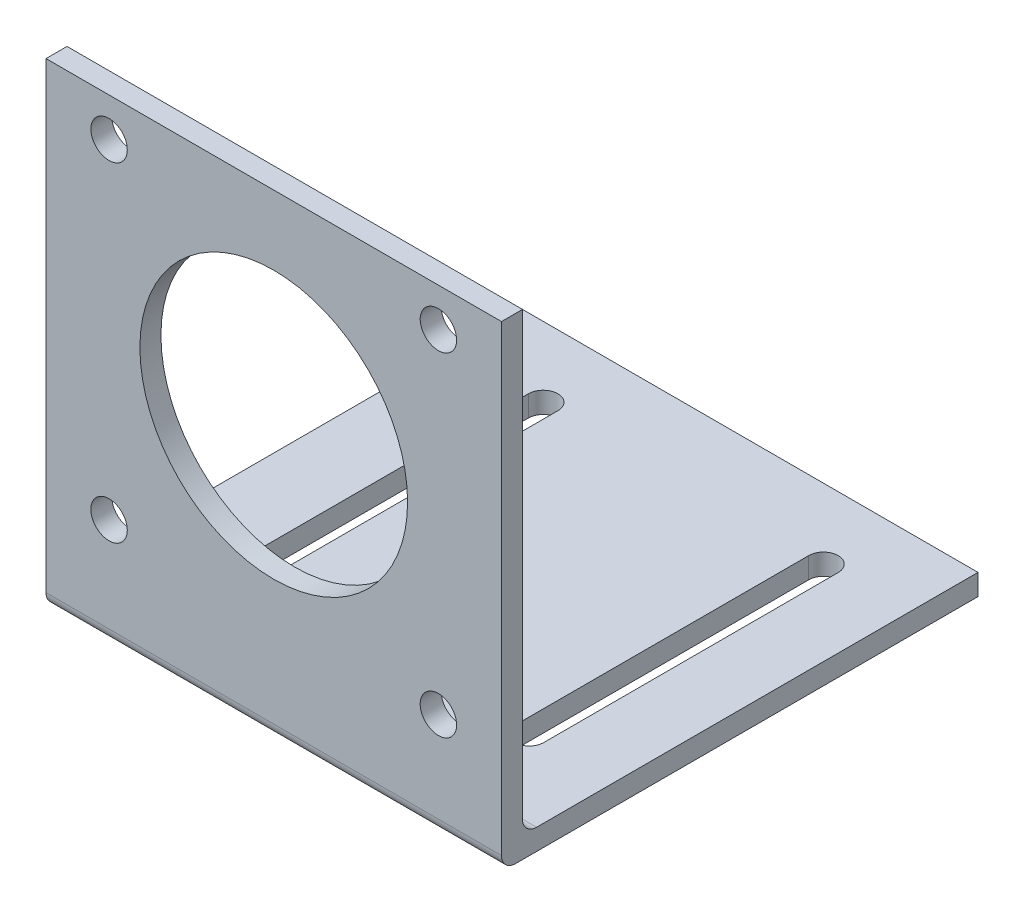
ISO-10303-21;
HEADER;
FILE_DESCRIPTION(('STEP AP214'),'2;1');
FILE_NAME('part.step','',(''),(''),'','','');
FILE_SCHEMA(('AUTOMOTIVE_DESIGN { 1 0 10303 214 1 1 1 1 }'));
ENDSEC;
DATA;
#1=APPLICATION_CONTEXT('core data for automotive mechanical design processes');
#2=APPLICATION_PROTOCOL_DEFINITION('international standard','automotive_design',2000,#1);
#3=PRODUCT_CONTEXT('',#1,'mechanical');
#4=PRODUCT('Part','Part','',(#3));
#5=PRODUCT_RELATED_PRODUCT_CATEGORY('part','',(#4));
#6=PRODUCT_DEFINITION_FORMATION('','',#4);
#7=PRODUCT_DEFINITION_CONTEXT('part definition',#1,'design');
#8=PRODUCT_DEFINITION('design','',#6,#7);
#9=PRODUCT_DEFINITION_SHAPE('','',#8);
#10=(LENGTH_UNIT() NAMED_UNIT(*) SI_UNIT(.MILLI.,.METRE.));
#11=(NAMED_UNIT(*) PLANE_ANGLE_UNIT() SI_UNIT($,.RADIAN.));
#12=(NAMED_UNIT(*) SI_UNIT($,.STERADIAN.) SOLID_ANGLE_UNIT());
#13=UNCERTAINTY_MEASURE_WITH_UNIT(LENGTH_MEASURE(1.E-05),#10,'distance_accuracy_value','');
#14=(GEOMETRIC_REPRESENTATION_CONTEXT(3) GLOBAL_UNCERTAINTY_ASSIGNED_CONTEXT((#13)) GLOBAL_UNIT_ASSIGNED_CONTEXT((#10,
#11,#12)) REPRESENTATION_CONTEXT('',''));
#15=CARTESIAN_POINT('',(0.,0.,0.));
#16=DIRECTION('',(0.,0.,1.));
#17=DIRECTION('',(1.,0.,0.));
#18=AXIS2_PLACEMENT_3D('',#15,#16,#17);
#19=CARTESIAN_POINT('',(65.,68.,0.));
#20=DIRECTION('',(0.,-1.,0.));
#21=DIRECTION('',(0.,0.,-1.));
#22=AXIS2_PLACEMENT_3D('',#19,#20,#21);
#23=PLANE('',#22);
#24=DIRECTION('',(0.,0.,1.));
#25=VECTOR('',#24,1.);
#26=CARTESIAN_POINT('',(0.,68.,0.));
#27=LINE('',#26,#25);
#28=CARTESIAN_POINT('',(0.,68.,-3.));
#29=VERTEX_POINT('',#28);
#30=CARTESIAN_POINT('',(0.,68.,0.));
#31=VERTEX_POINT('',#30);
#32=EDGE_CURVE('E190',#29,#31,#27,.T.);
#33=ORIENTED_EDGE('',*,*,#32,.T.);
#34=DIRECTION('',(-1.,0.,0.));
#35=VECTOR('',#34,1.);
#36=CARTESIAN_POINT('',(65.,68.,0.));
#37=LINE('',#36,#35);
#38=CARTESIAN_POINT('',(65.,68.,0.));
#39=VERTEX_POINT('',#38);
#40=EDGE_CURVE('E11',#39,#31,#37,.T.);
#41=ORIENTED_EDGE('',*,*,#40,.F.);
#42=DIRECTION('',(0.,0.,1.));
#43=VECTOR('',#42,1.);
#44=CARTESIAN_POINT('',(65.,68.,0.));
#45=LINE('',#44,#43);
#46=CARTESIAN_POINT('',(65.,68.,-3.));
#47=VERTEX_POINT('',#46);
#48=EDGE_CURVE('E223',#47,#39,#45,.T.);
#49=ORIENTED_EDGE('',*,*,#48,.F.);
#50=DIRECTION('',(-1.,0.,0.));
#51=VECTOR('',#50,1.);
#52=CARTESIAN_POINT('',(65.,68.,-3.));
#53=LINE('',#52,#51);
#54=EDGE_CURVE('E241',#47,#29,#53,.T.);
#55=ORIENTED_EDGE('',*,*,#54,.T.);
#56=EDGE_LOOP('',(#33,#41,#49,#55));
#57=FACE_BOUND('',#56,.T.);
#58=ADVANCED_FACE('F35',(#57),#23,.F.);
#59=CARTESIAN_POINT('',(65.,68.,0.));
#60=DIRECTION('',(0.,0.,-1.));
#61=DIRECTION('',(0.,1.,0.));
#62=AXIS2_PLACEMENT_3D('',#59,#60,#61);
#63=PLANE('',#62);
#64=CARTESIAN_POINT('',(9.,15.5,0.));
#65=DIRECTION('',(0.,0.,1.));
#66=DIRECTION('',(1.,0.,0.));
#67=AXIS2_PLACEMENT_3D('',#64,#65,#66);
#68=CIRCLE('',#67,2.6);
#69=CARTESIAN_POINT('',(11.6,15.5,0.));
#70=VERTEX_POINT('',#69);
#71=EDGE_CURVE('E420',#70,#70,#68,.T.);
#72=ORIENTED_EDGE('',*,*,#71,.F.);
#73=EDGE_LOOP('',(#72));
#74=FACE_BOUND('',#73,.T.);
#75=CARTESIAN_POINT('',(55.9966008458728,14.9347487870771,0.));
#76=DIRECTION('',(0.,0.,1.));
#77=DIRECTION('',(1.,0.,0.));
#78=AXIS2_PLACEMENT_3D('',#75,#76,#77);
#79=CIRCLE('',#78,2.6);
#80=CARTESIAN_POINT('',(58.5966008458728,14.9347487870771,0.));
#81=VERTEX_POINT('',#80);
#82=EDGE_CURVE('E416',#81,#81,#79,.T.);
#83=ORIENTED_EDGE('',*,*,#82,.F.);
#84=EDGE_LOOP('',(#83));
#85=FACE_BOUND('',#84,.T.);
#86=CARTESIAN_POINT('',(56.,62.5,0.));
#87=DIRECTION('',(0.,0.,1.));
#88=DIRECTION('',(1.,0.,0.));
#89=AXIS2_PLACEMENT_3D('',#86,#87,#88);
#90=CIRCLE('',#89,2.6);
#91=CARTESIAN_POINT('',(58.6,62.5,0.));
#92=VERTEX_POINT('',#91);
#93=EDGE_CURVE('E412',#92,#92,#90,.T.);
#94=ORIENTED_EDGE('',*,*,#93,.F.);
#95=EDGE_LOOP('',(#94));
#96=FACE_BOUND('',#95,.T.);
#97=CARTESIAN_POINT('',(9.,62.5,0.));
#98=DIRECTION('',(0.,0.,1.));
#99=DIRECTION('',(1.,0.,0.));
#100=AXIS2_PLACEMENT_3D('',#97,#98,#99);
#101=CIRCLE('',#100,2.6);
#102=CARTESIAN_POINT('',(11.6,62.5,0.));
#103=VERTEX_POINT('',#102);
#104=EDGE_CURVE('E410',#103,#103,#101,.T.);
#105=ORIENTED_EDGE('',*,*,#104,.F.);
#106=EDGE_LOOP('',(#105));
#107=FACE_BOUND('',#106,.T.);
#108=CARTESIAN_POINT('',(32.5,39.,0.));
#109=DIRECTION('',(0.,0.,1.));
#110=DIRECTION('',(1.,0.,0.));
#111=AXIS2_PLACEMENT_3D('',#108,#109,#110);
#112=CIRCLE('',#111,19.1);
#113=CARTESIAN_POINT('',(51.6,39.,0.));
#114=VERTEX_POINT('',#113);
#115=EDGE_CURVE('E177',#114,#114,#112,.T.);
#116=ORIENTED_EDGE('',*,*,#115,.F.);
#117=EDGE_LOOP('',(#116));
#118=FACE_BOUND('',#117,.T.);
#119=DIRECTION('',(0.,-1.,0.));
#120=VECTOR('',#119,1.);
#121=CARTESIAN_POINT('',(0.,68.,0.));
#122=LINE('',#121,#120);
#123=CARTESIAN_POINT('',(0.,2.00000000000001,0.));
#124=VERTEX_POINT('',#123);
#125=EDGE_CURVE('E244',#31,#124,#122,.T.);
#126=ORIENTED_EDGE('',*,*,#125,.T.);
#127=DIRECTION('',(-1.,0.,0.));
#128=VECTOR('',#127,1.);
#129=CARTESIAN_POINT('',(65.,2.00000000000001,0.));
#130=LINE('',#129,#128);
#131=CARTESIAN_POINT('',(65.,2.00000000000001,0.));
#132=VERTEX_POINT('',#131);
#133=EDGE_CURVE('E43',#132,#124,#130,.T.);
#134=ORIENTED_EDGE('',*,*,#133,.F.);
#135=DIRECTION('',(0.,-1.,0.));
#136=VECTOR('',#135,1.);
#137=CARTESIAN_POINT('',(65.,68.,0.));
#138=LINE('',#137,#136);
#139=EDGE_CURVE('E226',#39,#132,#138,.T.);
#140=ORIENTED_EDGE('',*,*,#139,.F.);
#141=ORIENTED_EDGE('',*,*,#40,.T.);
#142=EDGE_LOOP('',(#126,#134,#140,#141));
#143=FACE_BOUND('',#142,.T.);
#144=ADVANCED_FACE('F307',(#74,#85,#96,#107,#118,#143),#63,.F.);
#145=CARTESIAN_POINT('',(65.,2.,-2.));
#146=DIRECTION('',(-1.,0.,0.));
#147=DIRECTION('',(0.,0.,1.));
#148=AXIS2_PLACEMENT_3D('',#145,#146,#147);
#149=CYLINDRICAL_SURFACE('',#148,2.);
#150=CARTESIAN_POINT('',(0.,2.,-2.));
#151=DIRECTION('',(1.,0.,0.));
#152=DIRECTION('',(0.,0.,-1.));
#153=AXIS2_PLACEMENT_3D('',#150,#151,#152);
#154=CIRCLE('',#153,2.);
#155=CARTESIAN_POINT('',(0.,0.,-2.00000000000001));
#156=VERTEX_POINT('',#155);
#157=EDGE_CURVE('E246',#124,#156,#154,.T.);
#158=ORIENTED_EDGE('',*,*,#157,.T.);
#159=DIRECTION('',(-1.,0.,0.));
#160=VECTOR('',#159,1.);
#161=CARTESIAN_POINT('',(65.,0.,-2.00000000000001));
#162=LINE('',#161,#160);
#163=CARTESIAN_POINT('',(65.,0.,-2.00000000000001));
#164=VERTEX_POINT('',#163);
#165=EDGE_CURVE('E271',#164,#156,#162,.T.);
#166=ORIENTED_EDGE('',*,*,#165,.F.);
#167=CARTESIAN_POINT('',(65.,2.,-2.));
#168=DIRECTION('',(1.,0.,0.));
#169=DIRECTION('',(0.,0.,-1.));
#170=AXIS2_PLACEMENT_3D('',#167,#168,#169);
#171=CIRCLE('',#170,2.);
#172=EDGE_CURVE('E229',#132,#164,#171,.T.);
#173=ORIENTED_EDGE('',*,*,#172,.F.);
#174=ORIENTED_EDGE('',*,*,#133,.T.);
#175=EDGE_LOOP('',(#158,#166,#173,#174));
#176=FACE_BOUND('',#175,.T.);
#177=ADVANCED_FACE('F312',(#176),#149,.T.);
#178=CARTESIAN_POINT('',(65.,0.,-2.00000000000001));
#179=DIRECTION('',(0.,1.,0.));
#180=DIRECTION('',(0.,0.,1.));
#181=AXIS2_PLACEMENT_3D('',#178,#179,#180);
#182=PLANE('',#181);
#183=DIRECTION('',(0.,0.,-1.));
#184=VECTOR('',#183,1.);
#185=CARTESIAN_POINT('',(55.0454538110923,0.,-58.));
#186=LINE('',#185,#184);
#187=CARTESIAN_POINT('',(55.0454538110923,0.,-16.));
#188=VERTEX_POINT('',#187);
#189=CARTESIAN_POINT('',(55.0454538110923,0.,-58.));
#190=VERTEX_POINT('',#189);
#191=EDGE_CURVE('E161',#188,#190,#186,.T.);
#192=ORIENTED_EDGE('',*,*,#191,.T.);
#193=CARTESIAN_POINT('',(52.9454538110923,0.,-58.));
#194=DIRECTION('',(0.,1.,0.));
#195=DIRECTION('',(0.,0.,1.));
#196=AXIS2_PLACEMENT_3D('',#193,#194,#195);
#197=CIRCLE('',#196,2.1);
#198=CARTESIAN_POINT('',(50.8454538110923,0.,-58.));
#199=VERTEX_POINT('',#198);
#200=EDGE_CURVE('E153',#190,#199,#197,.T.);
#201=ORIENTED_EDGE('',*,*,#200,.T.);
#202=DIRECTION('',(0.,0.,1.));
#203=VECTOR('',#202,1.);
#204=CARTESIAN_POINT('',(50.8454538110923,0.,-58.));
#205=LINE('',#204,#203);
#206=CARTESIAN_POINT('',(50.8454538110923,0.,-16.));
#207=VERTEX_POINT('',#206);
#208=EDGE_CURVE('E164',#199,#207,#205,.T.);
#209=ORIENTED_EDGE('',*,*,#208,.T.);
#210=CARTESIAN_POINT('',(52.9454538110923,0.,-16.));
#211=DIRECTION('',(0.,1.,0.));
#212=DIRECTION('',(0.,0.,1.));
#213=AXIS2_PLACEMENT_3D('',#210,#211,#212);
#214=CIRCLE('',#213,2.10000000000001);
#215=EDGE_CURVE('E51',#207,#188,#214,.T.);
#216=ORIENTED_EDGE('',*,*,#215,.T.);
#217=EDGE_LOOP('',(#192,#201,#209,#216));
#218=FACE_BOUND('',#217,.T.);
#219=DIRECTION('',(0.,0.,-1.));
#220=VECTOR('',#219,1.);
#221=CARTESIAN_POINT('',(15.0454538110923,0.,-58.));
#222=LINE('',#221,#220);
#223=CARTESIAN_POINT('',(15.0454538110923,0.,-16.));
#224=VERTEX_POINT('',#223);
#225=CARTESIAN_POINT('',(15.0454538110923,0.,-58.));
#226=VERTEX_POINT('',#225);
#227=EDGE_CURVE('E202',#224,#226,#222,.T.);
#228=ORIENTED_EDGE('',*,*,#227,.T.);
#229=CARTESIAN_POINT('',(12.9454538110923,0.,-58.));
#230=DIRECTION('',(0.,1.,0.));
#231=DIRECTION('',(0.,0.,-1.));
#232=AXIS2_PLACEMENT_3D('',#229,#230,#231);
#233=CIRCLE('',#232,2.1);
#234=CARTESIAN_POINT('',(10.8454538110923,0.,-58.));
#235=VERTEX_POINT('',#234);
#236=EDGE_CURVE('E194',#226,#235,#233,.T.);
#237=ORIENTED_EDGE('',*,*,#236,.T.);
#238=DIRECTION('',(0.,0.,1.));
#239=VECTOR('',#238,1.);
#240=CARTESIAN_POINT('',(10.8454538110923,0.,-58.));
#241=LINE('',#240,#239);
#242=CARTESIAN_POINT('',(10.8454538110923,0.,-16.));
#243=VERTEX_POINT('',#242);
#244=EDGE_CURVE('E197',#235,#243,#241,.T.);
#245=ORIENTED_EDGE('',*,*,#244,.T.);
#246=CARTESIAN_POINT('',(12.9454538110923,0.,-16.));
#247=DIRECTION('',(0.,1.,0.));
#248=DIRECTION('',(0.,0.,-1.));
#249=AXIS2_PLACEMENT_3D('',#246,#247,#248);
#250=CIRCLE('',#249,2.10000000000001);
#251=EDGE_CURVE('E59',#243,#224,#250,.T.);
#252=ORIENTED_EDGE('',*,*,#251,.T.);
#253=EDGE_LOOP('',(#228,#237,#245,#252));
#254=FACE_BOUND('',#253,.T.);
#255=DIRECTION('',(0.,0.,-1.));
#256=VECTOR('',#255,1.);
#257=CARTESIAN_POINT('',(0.,0.,-2.00000000000001));
#258=LINE('',#257,#256);
#259=CARTESIAN_POINT('',(0.,0.,-68.));
#260=VERTEX_POINT('',#259);
#261=EDGE_CURVE('E248',#156,#260,#258,.T.);
#262=ORIENTED_EDGE('',*,*,#261,.T.);
#263=DIRECTION('',(-1.,0.,0.));
#264=VECTOR('',#263,1.);
#265=CARTESIAN_POINT('',(65.,0.,-68.));
#266=LINE('',#265,#264);
#267=CARTESIAN_POINT('',(65.,0.,-68.));
#268=VERTEX_POINT('',#267);
#269=EDGE_CURVE('E268',#268,#260,#266,.T.);
#270=ORIENTED_EDGE('',*,*,#269,.F.);
#271=DIRECTION('',(0.,0.,-1.));
#272=VECTOR('',#271,1.);
#273=CARTESIAN_POINT('',(65.,0.,-2.00000000000001));
#274=LINE('',#273,#272);
#275=EDGE_CURVE('E231',#164,#268,#274,.T.);
#276=ORIENTED_EDGE('',*,*,#275,.F.);
#277=ORIENTED_EDGE('',*,*,#165,.T.);
#278=EDGE_LOOP('',(#262,#270,#276,#277));
#279=FACE_BOUND('',#278,.T.);
#280=ADVANCED_FACE('F168',(#218,#254,#279),#182,.F.);
#281=CARTESIAN_POINT('',(65.,0.,-68.));
#282=DIRECTION('',(0.,0.,1.));
#283=DIRECTION('',(1.,0.,0.));
#284=AXIS2_PLACEMENT_3D('',#281,#282,#283);
#285=PLANE('',#284);
#286=DIRECTION('',(0.,1.,0.));
#287=VECTOR('',#286,1.);
#288=CARTESIAN_POINT('',(0.,0.,-68.));
#289=LINE('',#288,#287);
#290=CARTESIAN_POINT('',(0.,3.,-68.));
#291=VERTEX_POINT('',#290);
#292=EDGE_CURVE('E250',#260,#291,#289,.T.);
#293=ORIENTED_EDGE('',*,*,#292,.T.);
#294=DIRECTION('',(-1.,0.,0.));
#295=VECTOR('',#294,1.);
#296=CARTESIAN_POINT('',(65.,3.,-68.));
#297=LINE('',#296,#295);
#298=CARTESIAN_POINT('',(65.,3.,-68.));
#299=VERTEX_POINT('',#298);
#300=EDGE_CURVE('E265',#299,#291,#297,.T.);
#301=ORIENTED_EDGE('',*,*,#300,.F.);
#302=DIRECTION('',(0.,1.,0.));
#303=VECTOR('',#302,1.);
#304=CARTESIAN_POINT('',(65.,0.,-68.));
#305=LINE('',#304,#303);
#306=EDGE_CURVE('E233',#268,#299,#305,.T.);
#307=ORIENTED_EDGE('',*,*,#306,.F.);
#308=ORIENTED_EDGE('',*,*,#269,.T.);
#309=EDGE_LOOP('',(#293,#301,#307,#308));
#310=FACE_BOUND('',#309,.T.);
#311=ADVANCED_FACE('F344',(#310),#285,.F.);
#312=CARTESIAN_POINT('',(65.,3.,-68.));
#313=DIRECTION('',(0.,-1.,0.));
#314=DIRECTION('',(0.,0.,-1.));
#315=AXIS2_PLACEMENT_3D('',#312,#313,#314);
#316=PLANE('',#315);
#317=DIRECTION('',(0.,0.,1.));
#318=VECTOR('',#317,1.);
#319=CARTESIAN_POINT('',(50.8454538110923,3.,-58.));
#320=LINE('',#319,#318);
#321=CARTESIAN_POINT('',(50.8454538110923,3.,-58.));
#322=VERTEX_POINT('',#321);
#323=CARTESIAN_POINT('',(50.8454538110923,3.,-16.));
#324=VERTEX_POINT('',#323);
#325=EDGE_CURVE('E183',#322,#324,#320,.T.);
#326=ORIENTED_EDGE('',*,*,#325,.F.);
#327=CARTESIAN_POINT('',(52.9454538110923,3.,-58.));
#328=DIRECTION('',(0.,1.,0.));
#329=DIRECTION('',(0.,0.,1.));
#330=AXIS2_PLACEMENT_3D('',#327,#328,#329);
#331=CIRCLE('',#330,2.1);
#332=CARTESIAN_POINT('',(55.0454538110923,3.,-58.));
#333=VERTEX_POINT('',#332);
#334=EDGE_CURVE('E156',#333,#322,#331,.T.);
#335=ORIENTED_EDGE('',*,*,#334,.F.);
#336=DIRECTION('',(0.,0.,-1.));
#337=VECTOR('',#336,1.);
#338=CARTESIAN_POINT('',(55.0454538110923,3.,-58.));
#339=LINE('',#338,#337);
#340=CARTESIAN_POINT('',(55.0454538110923,3.,-16.));
#341=VERTEX_POINT('',#340);
#342=EDGE_CURVE('E171',#341,#333,#339,.T.);
#343=ORIENTED_EDGE('',*,*,#342,.F.);
#344=CARTESIAN_POINT('',(52.9454538110923,3.,-16.));
#345=DIRECTION('',(0.,1.,0.));
#346=DIRECTION('',(0.,0.,1.));
#347=AXIS2_PLACEMENT_3D('',#344,#345,#346);
#348=CIRCLE('',#347,2.10000000000001);
#349=EDGE_CURVE('E174',#324,#341,#348,.T.);
#350=ORIENTED_EDGE('',*,*,#349,.F.);
#351=EDGE_LOOP('',(#326,#335,#343,#350));
#352=FACE_BOUND('',#351,.T.);
#353=DIRECTION('',(0.,0.,1.));
#354=VECTOR('',#353,1.);
#355=CARTESIAN_POINT('',(10.8454538110923,3.,-58.));
#356=LINE('',#355,#354);
#357=CARTESIAN_POINT('',(10.8454538110923,3.,-58.));
#358=VERTEX_POINT('',#357);
#359=CARTESIAN_POINT('',(10.8454538110923,3.,-16.));
#360=VERTEX_POINT('',#359);
#361=EDGE_CURVE('E208',#358,#360,#356,.T.);
#362=ORIENTED_EDGE('',*,*,#361,.F.);
#363=CARTESIAN_POINT('',(12.9454538110923,3.,-58.));
#364=DIRECTION('',(0.,1.,0.));
#365=DIRECTION('',(0.,0.,-1.));
#366=AXIS2_PLACEMENT_3D('',#363,#364,#365);
#367=CIRCLE('',#366,2.1);
#368=CARTESIAN_POINT('',(15.0454538110923,3.,-58.));
#369=VERTEX_POINT('',#368);
#370=EDGE_CURVE('E206',#369,#358,#367,.T.);
#371=ORIENTED_EDGE('',*,*,#370,.F.);
#372=DIRECTION('',(0.,0.,-1.));
#373=VECTOR('',#372,1.);
#374=CARTESIAN_POINT('',(15.0454538110923,3.,-58.));
#375=LINE('',#374,#373);
#376=CARTESIAN_POINT('',(15.0454538110923,3.,-16.));
#377=VERTEX_POINT('',#376);
#378=EDGE_CURVE('E198',#377,#369,#375,.T.);
#379=ORIENTED_EDGE('',*,*,#378,.F.);
#380=CARTESIAN_POINT('',(12.9454538110923,3.,-16.));
#381=DIRECTION('',(0.,1.,0.));
#382=DIRECTION('',(0.,0.,-1.));
#383=AXIS2_PLACEMENT_3D('',#380,#381,#382);
#384=CIRCLE('',#383,2.10000000000001);
#385=EDGE_CURVE('E211',#360,#377,#384,.T.);
#386=ORIENTED_EDGE('',*,*,#385,.F.);
#387=EDGE_LOOP('',(#362,#371,#379,#386));
#388=FACE_BOUND('',#387,.T.);
#389=DIRECTION('',(0.,0.,1.));
#390=VECTOR('',#389,1.);
#391=CARTESIAN_POINT('',(0.,3.,-68.));
#392=LINE('',#391,#390);
#393=CARTESIAN_POINT('',(0.,2.99999999999999,-5.00000000000002));
#394=VERTEX_POINT('',#393);
#395=EDGE_CURVE('E252',#291,#394,#392,.T.);
#396=ORIENTED_EDGE('',*,*,#395,.T.);
#397=DIRECTION('',(-1.,0.,0.));
#398=VECTOR('',#397,1.);
#399=CARTESIAN_POINT('',(65.,2.99999999999999,-5.00000000000002));
#400=LINE('',#399,#398);
#401=CARTESIAN_POINT('',(65.,2.99999999999999,-5.00000000000002));
#402=VERTEX_POINT('',#401);
#403=EDGE_CURVE('E262',#402,#394,#400,.T.);
#404=ORIENTED_EDGE('',*,*,#403,.F.);
#405=DIRECTION('',(0.,0.,1.));
#406=VECTOR('',#405,1.);
#407=CARTESIAN_POINT('',(65.,3.,-68.));
#408=LINE('',#407,#406);
#409=EDGE_CURVE('E235',#299,#402,#408,.T.);
#410=ORIENTED_EDGE('',*,*,#409,.F.);
#411=ORIENTED_EDGE('',*,*,#300,.T.);
#412=EDGE_LOOP('',(#396,#404,#410,#411));
#413=FACE_BOUND('',#412,.T.);
#414=ADVANCED_FACE('F339',(#352,#388,#413),#316,.F.);
#415=CARTESIAN_POINT('',(65.,4.99999999999999,-5.));
#416=DIRECTION('',(-1.,0.,0.));
#417=DIRECTION('',(0.,0.,1.));
#418=AXIS2_PLACEMENT_3D('',#415,#416,#417);
#419=CYLINDRICAL_SURFACE('',#418,2.);
#420=CARTESIAN_POINT('',(0.,4.99999999999999,-5.));
#421=DIRECTION('',(-1.,0.,0.));
#422=DIRECTION('',(0.,0.,1.));
#423=AXIS2_PLACEMENT_3D('',#420,#421,#422);
#424=CIRCLE('',#423,2.);
#425=CARTESIAN_POINT('',(0.,4.99999999999999,-3.));
#426=VERTEX_POINT('',#425);
#427=EDGE_CURVE('E254',#394,#426,#424,.T.);
#428=ORIENTED_EDGE('',*,*,#427,.T.);
#429=DIRECTION('',(-1.,0.,0.));
#430=VECTOR('',#429,1.);
#431=CARTESIAN_POINT('',(65.,4.99999999999999,-3.));
#432=LINE('',#431,#430);
#433=CARTESIAN_POINT('',(65.,4.99999999999999,-3.));
#434=VERTEX_POINT('',#433);
#435=EDGE_CURVE('E259',#434,#426,#432,.T.);
#436=ORIENTED_EDGE('',*,*,#435,.F.);
#437=CARTESIAN_POINT('',(65.,4.99999999999999,-5.));
#438=DIRECTION('',(-1.,0.,0.));
#439=DIRECTION('',(0.,0.,1.));
#440=AXIS2_PLACEMENT_3D('',#437,#438,#439);
#441=CIRCLE('',#440,2.);
#442=EDGE_CURVE('E237',#402,#434,#441,.T.);
#443=ORIENTED_EDGE('',*,*,#442,.F.);
#444=ORIENTED_EDGE('',*,*,#403,.T.);
#445=EDGE_LOOP('',(#428,#436,#443,#444));
#446=FACE_BOUND('',#445,.T.);
#447=ADVANCED_FACE('F334',(#446),#419,.F.);
#448=CARTESIAN_POINT('',(65.,5.00000000000001,-3.));
#449=DIRECTION('',(0.,0.,1.));
#450=DIRECTION('',(0.,-1.,0.));
#451=AXIS2_PLACEMENT_3D('',#448,#449,#450);
#452=PLANE('',#451);
#453=CARTESIAN_POINT('',(9.,15.5,-3.));
#454=DIRECTION('',(0.,0.,1.));
#455=DIRECTION('',(0.,-1.,0.));
#456=AXIS2_PLACEMENT_3D('',#453,#454,#455);
#457=CIRCLE('',#456,2.6);
#458=CARTESIAN_POINT('',(9.,12.9,-3.));
#459=VERTEX_POINT('',#458);
#460=EDGE_CURVE('E38',#459,#459,#457,.T.);
#461=ORIENTED_EDGE('',*,*,#460,.T.);
#462=EDGE_LOOP('',(#461));
#463=FACE_BOUND('',#462,.T.);
#464=CARTESIAN_POINT('',(55.9966008458728,14.9347487870771,-3.));
#465=DIRECTION('',(0.,0.,1.));
#466=DIRECTION('',(0.,-1.,0.));
#467=AXIS2_PLACEMENT_3D('',#464,#465,#466);
#468=CIRCLE('',#467,2.6);
#469=CARTESIAN_POINT('',(55.9966008458728,12.3347487870771,-3.));
#470=VERTEX_POINT('',#469);
#471=EDGE_CURVE('E284',#470,#470,#468,.T.);
#472=ORIENTED_EDGE('',*,*,#471,.T.);
#473=EDGE_LOOP('',(#472));
#474=FACE_BOUND('',#473,.T.);
#475=CARTESIAN_POINT('',(56.,62.5,-3.));
#476=DIRECTION('',(0.,0.,1.));
#477=DIRECTION('',(0.,-1.,0.));
#478=AXIS2_PLACEMENT_3D('',#475,#476,#477);
#479=CIRCLE('',#478,2.6);
#480=CARTESIAN_POINT('',(56.,59.9,-3.));
#481=VERTEX_POINT('',#480);
#482=EDGE_CURVE('E282',#481,#481,#479,.T.);
#483=ORIENTED_EDGE('',*,*,#482,.T.);
#484=EDGE_LOOP('',(#483));
#485=FACE_BOUND('',#484,.T.);
#486=CARTESIAN_POINT('',(9.,62.5,-3.));
#487=DIRECTION('',(0.,0.,1.));
#488=DIRECTION('',(0.,-1.,0.));
#489=AXIS2_PLACEMENT_3D('',#486,#487,#488);
#490=CIRCLE('',#489,2.6);
#491=CARTESIAN_POINT('',(9.,59.9,-3.));
#492=VERTEX_POINT('',#491);
#493=EDGE_CURVE('E279',#492,#492,#490,.T.);
#494=ORIENTED_EDGE('',*,*,#493,.T.);
#495=EDGE_LOOP('',(#494));
#496=FACE_BOUND('',#495,.T.);
#497=CARTESIAN_POINT('',(32.5,39.,-3.));
#498=DIRECTION('',(0.,0.,1.));
#499=DIRECTION('',(0.,-1.,0.));
#500=AXIS2_PLACEMENT_3D('',#497,#498,#499);
#501=CIRCLE('',#500,19.1);
#502=CARTESIAN_POINT('',(32.5,19.9,-3.));
#503=VERTEX_POINT('',#502);
#504=EDGE_CURVE('E276',#503,#503,#501,.T.);
#505=ORIENTED_EDGE('',*,*,#504,.T.);
#506=EDGE_LOOP('',(#505));
#507=FACE_BOUND('',#506,.T.);
#508=DIRECTION('',(0.,1.,0.));
#509=VECTOR('',#508,1.);
#510=CARTESIAN_POINT('',(0.,5.00000000000001,-3.));
#511=LINE('',#510,#509);
#512=EDGE_CURVE('E227',#426,#29,#511,.T.);
#513=ORIENTED_EDGE('',*,*,#512,.T.);
#514=ORIENTED_EDGE('',*,*,#54,.F.);
#515=DIRECTION('',(0.,1.,0.));
#516=VECTOR('',#515,1.);
#517=CARTESIAN_POINT('',(65.,5.00000000000001,-3.));
#518=LINE('',#517,#516);
#519=EDGE_CURVE('E239',#434,#47,#518,.T.);
#520=ORIENTED_EDGE('',*,*,#519,.F.);
#521=ORIENTED_EDGE('',*,*,#435,.T.);
#522=EDGE_LOOP('',(#513,#514,#520,#521));
#523=FACE_BOUND('',#522,.T.);
#524=ADVANCED_FACE('F291',(#463,#474,#485,#496,#507,#523),#452,.F.);
#525=CARTESIAN_POINT('',(65.,4.99999999999999,-5.));
#526=DIRECTION('',(-1.,0.,0.));
#527=DIRECTION('',(0.,0.,1.));
#528=AXIS2_PLACEMENT_3D('',#525,#526,#527);
#529=PLANE('',#528);
#530=ORIENTED_EDGE('',*,*,#48,.T.);
#531=ORIENTED_EDGE('',*,*,#139,.T.);
#532=ORIENTED_EDGE('',*,*,#172,.T.);
#533=ORIENTED_EDGE('',*,*,#275,.T.);
#534=ORIENTED_EDGE('',*,*,#306,.T.);
#535=ORIENTED_EDGE('',*,*,#409,.T.);
#536=ORIENTED_EDGE('',*,*,#442,.T.);
#537=ORIENTED_EDGE('',*,*,#519,.T.);
#538=EDGE_LOOP('',(#530,#531,#532,#533,#534,#535,#536,#537));
#539=FACE_BOUND('',#538,.T.);
#540=ADVANCED_FACE('F328',(#539),#529,.F.);
#541=CARTESIAN_POINT('',(0.,4.99999999999999,-5.));
#542=DIRECTION('',(-1.,0.,0.));
#543=DIRECTION('',(0.,0.,1.));
#544=AXIS2_PLACEMENT_3D('',#541,#542,#543);
#545=PLANE('',#544);
#546=ORIENTED_EDGE('',*,*,#32,.F.);
#547=ORIENTED_EDGE('',*,*,#512,.F.);
#548=ORIENTED_EDGE('',*,*,#427,.F.);
#549=ORIENTED_EDGE('',*,*,#395,.F.);
#550=ORIENTED_EDGE('',*,*,#292,.F.);
#551=ORIENTED_EDGE('',*,*,#261,.F.);
#552=ORIENTED_EDGE('',*,*,#157,.F.);
#553=ORIENTED_EDGE('',*,*,#125,.F.);
#554=EDGE_LOOP('',(#546,#547,#548,#549,#550,#551,#552,#553));
#555=FACE_BOUND('',#554,.T.);
#556=ADVANCED_FACE('F320',(#555),#545,.T.);
#557=CARTESIAN_POINT('',(12.9454538110923,0.,-58.));
#558=DIRECTION('',(0.,1.,0.));
#559=DIRECTION('',(0.,0.,1.));
#560=AXIS2_PLACEMENT_3D('',#557,#558,#559);
#561=CYLINDRICAL_SURFACE('',#560,2.1);
#562=ORIENTED_EDGE('',*,*,#370,.T.);
#563=DIRECTION('',(0.,1.,0.));
#564=VECTOR('',#563,1.);
#565=CARTESIAN_POINT('',(10.8454538110923,0.,-58.));
#566=LINE('',#565,#564);
#567=EDGE_CURVE('E205',#235,#358,#566,.T.);
#568=ORIENTED_EDGE('',*,*,#567,.F.);
#569=ORIENTED_EDGE('',*,*,#236,.F.);
#570=DIRECTION('',(0.,1.,0.));
#571=VECTOR('',#570,1.);
#572=CARTESIAN_POINT('',(15.0454538110923,0.,-58.));
#573=LINE('',#572,#571);
#574=EDGE_CURVE('E184',#226,#369,#573,.T.);
#575=ORIENTED_EDGE('',*,*,#574,.T.);
#576=EDGE_LOOP('',(#562,#568,#569,#575));
#577=FACE_BOUND('',#576,.T.);
#578=ADVANCED_FACE('F368',(#577),#561,.F.);
#579=CARTESIAN_POINT('',(15.0454538110923,0.,-58.));
#580=DIRECTION('',(1.,0.,0.));
#581=DIRECTION('',(0.,0.,-1.));
#582=AXIS2_PLACEMENT_3D('',#579,#580,#581);
#583=PLANE('',#582);
#584=ORIENTED_EDGE('',*,*,#378,.T.);
#585=ORIENTED_EDGE('',*,*,#574,.F.);
#586=ORIENTED_EDGE('',*,*,#227,.F.);
#587=DIRECTION('',(0.,1.,0.));
#588=VECTOR('',#587,1.);
#589=CARTESIAN_POINT('',(15.0454538110923,0.,-16.));
#590=LINE('',#589,#588);
#591=EDGE_CURVE('E217',#224,#377,#590,.T.);
#592=ORIENTED_EDGE('',*,*,#591,.T.);
#593=EDGE_LOOP('',(#584,#585,#586,#592));
#594=FACE_BOUND('',#593,.T.);
#595=ADVANCED_FACE('F373',(#594),#583,.F.);
#596=CARTESIAN_POINT('',(12.9454538110923,0.,-16.));
#597=DIRECTION('',(0.,1.,0.));
#598=DIRECTION('',(0.,0.,1.));
#599=AXIS2_PLACEMENT_3D('',#596,#597,#598);
#600=CYLINDRICAL_SURFACE('',#599,2.10000000000001);
#601=ORIENTED_EDGE('',*,*,#385,.T.);
#602=ORIENTED_EDGE('',*,*,#591,.F.);
#603=ORIENTED_EDGE('',*,*,#251,.F.);
#604=DIRECTION('',(0.,1.,0.));
#605=VECTOR('',#604,1.);
#606=CARTESIAN_POINT('',(10.8454538110923,0.,-16.));
#607=LINE('',#606,#605);
#608=EDGE_CURVE('E219',#243,#360,#607,.T.);
#609=ORIENTED_EDGE('',*,*,#608,.T.);
#610=EDGE_LOOP('',(#601,#602,#603,#609));
#611=FACE_BOUND('',#610,.T.);
#612=ADVANCED_FACE('F378',(#611),#600,.F.);
#613=CARTESIAN_POINT('',(10.8454538110923,0.,-58.));
#614=DIRECTION('',(-1.,0.,0.));
#615=DIRECTION('',(0.,0.,1.));
#616=AXIS2_PLACEMENT_3D('',#613,#614,#615);
#617=PLANE('',#616);
#618=ORIENTED_EDGE('',*,*,#361,.T.);
#619=ORIENTED_EDGE('',*,*,#608,.F.);
#620=ORIENTED_EDGE('',*,*,#244,.F.);
#621=ORIENTED_EDGE('',*,*,#567,.T.);
#622=EDGE_LOOP('',(#618,#619,#620,#621));
#623=FACE_BOUND('',#622,.T.);
#624=ADVANCED_FACE('F375',(#623),#617,.F.);
#625=CARTESIAN_POINT('',(52.9454538110923,0.,-58.));
#626=DIRECTION('',(0.,1.,0.));
#627=DIRECTION('',(0.,0.,1.));
#628=AXIS2_PLACEMENT_3D('',#625,#626,#627);
#629=CYLINDRICAL_SURFACE('',#628,2.1);
#630=ORIENTED_EDGE('',*,*,#334,.T.);
#631=DIRECTION('',(0.,1.,0.));
#632=VECTOR('',#631,1.);
#633=CARTESIAN_POINT('',(50.8454538110923,0.,-58.));
#634=LINE('',#633,#632);
#635=EDGE_CURVE('E149',#199,#322,#634,.T.);
#636=ORIENTED_EDGE('',*,*,#635,.F.);
#637=ORIENTED_EDGE('',*,*,#200,.F.);
#638=DIRECTION('',(0.,1.,0.));
#639=VECTOR('',#638,1.);
#640=CARTESIAN_POINT('',(55.0454538110923,0.,-58.));
#641=LINE('',#640,#639);
#642=EDGE_CURVE('E188',#190,#333,#641,.T.);
#643=ORIENTED_EDGE('',*,*,#642,.T.);
#644=EDGE_LOOP('',(#630,#636,#637,#643));
#645=FACE_BOUND('',#644,.T.);
#646=ADVANCED_FACE('F151',(#645),#629,.F.);
#647=CARTESIAN_POINT('',(55.0454538110923,0.,-58.));
#648=DIRECTION('',(1.,0.,0.));
#649=DIRECTION('',(0.,0.,-1.));
#650=AXIS2_PLACEMENT_3D('',#647,#648,#649);
#651=PLANE('',#650);
#652=ORIENTED_EDGE('',*,*,#342,.T.);
#653=ORIENTED_EDGE('',*,*,#642,.F.);
#654=ORIENTED_EDGE('',*,*,#191,.F.);
#655=DIRECTION('',(0.,1.,0.));
#656=VECTOR('',#655,1.);
#657=CARTESIAN_POINT('',(55.0454538110923,0.,-16.));
#658=LINE('',#657,#656);
#659=EDGE_CURVE('E191',#188,#341,#658,.T.);
#660=ORIENTED_EDGE('',*,*,#659,.T.);
#661=EDGE_LOOP('',(#652,#653,#654,#660));
#662=FACE_BOUND('',#661,.T.);
#663=ADVANCED_FACE('F387',(#662),#651,.F.);
#664=CARTESIAN_POINT('',(52.9454538110923,0.,-16.));
#665=DIRECTION('',(0.,1.,0.));
#666=DIRECTION('',(0.,0.,1.));
#667=AXIS2_PLACEMENT_3D('',#664,#665,#666);
#668=CYLINDRICAL_SURFACE('',#667,2.10000000000001);
#669=ORIENTED_EDGE('',*,*,#349,.T.);
#670=ORIENTED_EDGE('',*,*,#659,.F.);
#671=ORIENTED_EDGE('',*,*,#215,.F.);
#672=DIRECTION('',(0.,1.,0.));
#673=VECTOR('',#672,1.);
#674=CARTESIAN_POINT('',(50.8454538110923,0.,-16.));
#675=LINE('',#674,#673);
#676=EDGE_CURVE('E160',#207,#324,#675,.T.);
#677=ORIENTED_EDGE('',*,*,#676,.T.);
#678=EDGE_LOOP('',(#669,#670,#671,#677));
#679=FACE_BOUND('',#678,.T.);
#680=ADVANCED_FACE('F391',(#679),#668,.F.);
#681=CARTESIAN_POINT('',(50.8454538110923,0.,-58.));
#682=DIRECTION('',(-1.,0.,0.));
#683=DIRECTION('',(0.,0.,1.));
#684=AXIS2_PLACEMENT_3D('',#681,#682,#683);
#685=PLANE('',#684);
#686=ORIENTED_EDGE('',*,*,#325,.T.);
#687=ORIENTED_EDGE('',*,*,#676,.F.);
#688=ORIENTED_EDGE('',*,*,#208,.F.);
#689=ORIENTED_EDGE('',*,*,#635,.T.);
#690=EDGE_LOOP('',(#686,#687,#688,#689));
#691=FACE_BOUND('',#690,.T.);
#692=ADVANCED_FACE('F165',(#691),#685,.F.);
#693=CARTESIAN_POINT('',(32.5,39.,-68.));
#694=DIRECTION('',(0.,0.,1.));
#695=DIRECTION('',(1.,0.,0.));
#696=AXIS2_PLACEMENT_3D('',#693,#694,#695);
#697=CYLINDRICAL_SURFACE('',#696,19.1);
#698=ORIENTED_EDGE('',*,*,#115,.T.);
#699=EDGE_LOOP('',(#698));
#700=FACE_BOUND('',#699,.T.);
#701=ORIENTED_EDGE('',*,*,#504,.F.);
#702=EDGE_LOOP('',(#701));
#703=FACE_BOUND('',#702,.T.);
#704=ADVANCED_FACE('F390',(#700,#703),#697,.F.);
#705=CARTESIAN_POINT('',(9.,62.5,-68.));
#706=DIRECTION('',(0.,0.,1.));
#707=DIRECTION('',(1.,0.,0.));
#708=AXIS2_PLACEMENT_3D('',#705,#706,#707);
#709=CYLINDRICAL_SURFACE('',#708,2.6);
#710=ORIENTED_EDGE('',*,*,#104,.T.);
#711=EDGE_LOOP('',(#710));
#712=FACE_BOUND('',#711,.T.);
#713=ORIENTED_EDGE('',*,*,#493,.F.);
#714=EDGE_LOOP('',(#713));
#715=FACE_BOUND('',#714,.T.);
#716=ADVANCED_FACE('F397',(#712,#715),#709,.F.);
#717=CARTESIAN_POINT('',(56.,62.5,-68.));
#718=DIRECTION('',(0.,0.,1.));
#719=DIRECTION('',(1.,0.,0.));
#720=AXIS2_PLACEMENT_3D('',#717,#718,#719);
#721=CYLINDRICAL_SURFACE('',#720,2.6);
#722=ORIENTED_EDGE('',*,*,#93,.T.);
#723=EDGE_LOOP('',(#722));
#724=FACE_BOUND('',#723,.T.);
#725=ORIENTED_EDGE('',*,*,#482,.F.);
#726=EDGE_LOOP('',(#725));
#727=FACE_BOUND('',#726,.T.);
#728=ADVANCED_FACE('F301',(#724,#727),#721,.F.);
#729=CARTESIAN_POINT('',(55.9966008458728,14.9347487870771,-68.));
#730=DIRECTION('',(0.,0.,1.));
#731=DIRECTION('',(1.,0.,0.));
#732=AXIS2_PLACEMENT_3D('',#729,#730,#731);
#733=CYLINDRICAL_SURFACE('',#732,2.6);
#734=ORIENTED_EDGE('',*,*,#82,.T.);
#735=EDGE_LOOP('',(#734));
#736=FACE_BOUND('',#735,.T.);
#737=ORIENTED_EDGE('',*,*,#471,.F.);
#738=EDGE_LOOP('',(#737));
#739=FACE_BOUND('',#738,.T.);
#740=ADVANCED_FACE('F295',(#736,#739),#733,.F.);
#741=CARTESIAN_POINT('',(9.,15.5,-68.));
#742=DIRECTION('',(0.,0.,1.));
#743=DIRECTION('',(1.,0.,0.));
#744=AXIS2_PLACEMENT_3D('',#741,#742,#743);
#745=CYLINDRICAL_SURFACE('',#744,2.6);
#746=ORIENTED_EDGE('',*,*,#71,.T.);
#747=EDGE_LOOP('',(#746));
#748=FACE_BOUND('',#747,.T.);
#749=ORIENTED_EDGE('',*,*,#460,.F.);
#750=EDGE_LOOP('',(#749));
#751=FACE_BOUND('',#750,.T.);
#752=ADVANCED_FACE('F293',(#748,#751),#745,.F.);
#753=CLOSED_SHELL('',(#58,#144,#177,#280,#311,#414,#447,#524,#540,#556,#578,#595,#612,#624,#646,
#663,#680,#692,#704,#716,#728,#740,#752));
#754=MANIFOLD_SOLID_BREP('B2',#753);
#755=ADVANCED_BREP_SHAPE_REPRESENTATION('',(#18,#754),#14);
#756=SHAPE_DEFINITION_REPRESENTATION(#9,#755);
ENDSEC;
END-ISO-10303-21;
